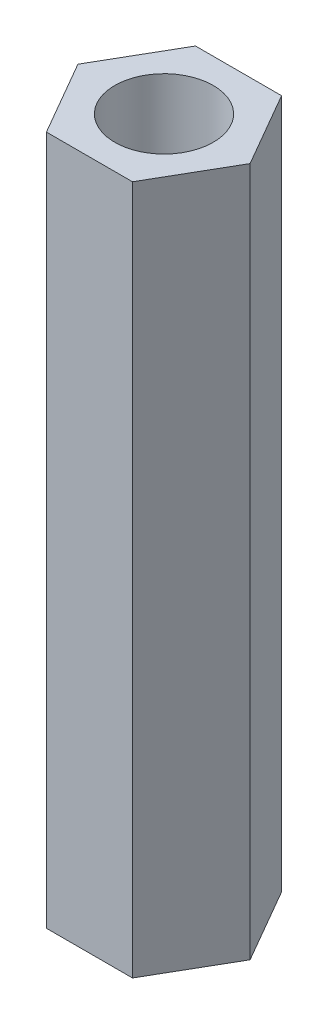
ISO-10303-21;
HEADER;
FILE_DESCRIPTION(('STEP AP214'),'2;1');
FILE_NAME('part.step','',(''),(''),'','','');
FILE_SCHEMA(('AUTOMOTIVE_DESIGN { 1 0 10303 214 1 1 1 1 }'));
ENDSEC;
DATA;
#1=APPLICATION_CONTEXT('core data for automotive mechanical design processes');
#2=APPLICATION_PROTOCOL_DEFINITION('international standard','automotive_design',2000,#1);
#3=PRODUCT_CONTEXT('',#1,'mechanical');
#4=PRODUCT('Part','Part','',(#3));
#5=PRODUCT_RELATED_PRODUCT_CATEGORY('part','',(#4));
#6=PRODUCT_DEFINITION_FORMATION('','',#4);
#7=PRODUCT_DEFINITION_CONTEXT('part definition',#1,'design');
#8=PRODUCT_DEFINITION('design','',#6,#7);
#9=PRODUCT_DEFINITION_SHAPE('','',#8);
#10=(LENGTH_UNIT() NAMED_UNIT(*) SI_UNIT(.MILLI.,.METRE.));
#11=(NAMED_UNIT(*) PLANE_ANGLE_UNIT() SI_UNIT($,.RADIAN.));
#12=(NAMED_UNIT(*) SI_UNIT($,.STERADIAN.) SOLID_ANGLE_UNIT());
#13=UNCERTAINTY_MEASURE_WITH_UNIT(LENGTH_MEASURE(1.E-05),#10,'distance_accuracy_value','');
#14=(GEOMETRIC_REPRESENTATION_CONTEXT(3) GLOBAL_UNCERTAINTY_ASSIGNED_CONTEXT((#13)) GLOBAL_UNIT_ASSIGNED_CONTEXT((#10,
#11,#12)) REPRESENTATION_CONTEXT('',''));
#15=CARTESIAN_POINT('',(0.,0.,0.));
#16=DIRECTION('',(0.,0.,1.));
#17=DIRECTION('',(1.,0.,0.));
#18=AXIS2_PLACEMENT_3D('',#15,#16,#17);
#19=CARTESIAN_POINT('',(0.,21.,0.));
#20=DIRECTION('',(0.,1.,0.));
#21=DIRECTION('',(0.,0.,1.));
#22=AXIS2_PLACEMENT_3D('',#19,#20,#21);
#23=PLANE('',#22);
#24=DIRECTION('',(0.499999999999995,0.,-0.866025403784441));
#25=VECTOR('',#24,1.);
#26=CARTESIAN_POINT('',(1.31058511106047,21.,2.26999999999998));
#27=LINE('',#26,#25);
#28=CARTESIAN_POINT('',(1.31058511106047,21.,2.26999999999998));
#29=VERTEX_POINT('',#28);
#30=CARTESIAN_POINT('',(2.62117022212089,21.,0.));
#31=VERTEX_POINT('',#30);
#32=EDGE_CURVE('E131',#29,#31,#27,.T.);
#33=ORIENTED_EDGE('',*,*,#32,.T.);
#34=DIRECTION('',(-0.500000000000001,0.,-0.866025403784438));
#35=VECTOR('',#34,1.);
#36=CARTESIAN_POINT('',(2.62117022212089,21.,0.));
#37=LINE('',#36,#35);
#38=CARTESIAN_POINT('',(1.31058511106044,21.,-2.27));
#39=VERTEX_POINT('',#38);
#40=EDGE_CURVE('E89',#31,#39,#37,.T.);
#41=ORIENTED_EDGE('',*,*,#40,.T.);
#42=DIRECTION('',(-1.,0.,0.));
#43=VECTOR('',#42,1.);
#44=CARTESIAN_POINT('',(1.31058511106044,21.,-2.27));
#45=LINE('',#44,#43);
#46=CARTESIAN_POINT('',(-1.31058511106046,21.,-2.26999999999999));
#47=VERTEX_POINT('',#46);
#48=EDGE_CURVE('E102',#39,#47,#45,.T.);
#49=ORIENTED_EDGE('',*,*,#48,.T.);
#50=DIRECTION('',(-0.499999999999995,0.,0.866025403784442));
#51=VECTOR('',#50,1.);
#52=CARTESIAN_POINT('',(-1.31058511106046,21.,-2.26999999999999));
#53=LINE('',#52,#51);
#54=CARTESIAN_POINT('',(-2.62117022212089,21.,0.));
#55=VERTEX_POINT('',#54);
#56=EDGE_CURVE('E96',#47,#55,#53,.T.);
#57=ORIENTED_EDGE('',*,*,#56,.T.);
#58=DIRECTION('',(0.500000000000007,0.,0.866025403784435));
#59=VECTOR('',#58,1.);
#60=CARTESIAN_POINT('',(-2.62117022212089,21.,0.));
#61=LINE('',#60,#59);
#62=CARTESIAN_POINT('',(-1.31058511106042,21.,2.27));
#63=VERTEX_POINT('',#62);
#64=EDGE_CURVE('E100',#55,#63,#61,.T.);
#65=ORIENTED_EDGE('',*,*,#64,.T.);
#66=DIRECTION('',(1.,0.,0.));
#67=VECTOR('',#66,1.);
#68=CARTESIAN_POINT('',(-1.31058511106042,21.,2.27));
#69=LINE('',#68,#67);
#70=EDGE_CURVE('E52',#63,#29,#69,.T.);
#71=ORIENTED_EDGE('',*,*,#70,.T.);
#72=EDGE_LOOP('',(#33,#41,#49,#57,#65,#71));
#73=FACE_BOUND('',#72,.T.);
#74=CARTESIAN_POINT('',(0.,21.,0.));
#75=DIRECTION('',(0.,1.,0.));
#76=DIRECTION('',(0.,0.,1.));
#77=AXIS2_PLACEMENT_3D('',#74,#75,#76);
#78=CIRCLE('',#77,1.5);
#79=CARTESIAN_POINT('',(0.,21.,-1.5));
#80=VERTEX_POINT('',#79);
#81=EDGE_CURVE('E124',#80,#80,#78,.T.);
#82=ORIENTED_EDGE('',*,*,#81,.F.);
#83=EDGE_LOOP('',(#82));
#84=FACE_BOUND('',#83,.T.);
#85=ADVANCED_FACE('F35',(#73,#84),#23,.T.);
#86=CARTESIAN_POINT('',(0.,0.,0.));
#87=DIRECTION('',(0.,1.,0.));
#88=DIRECTION('',(0.,0.,1.));
#89=AXIS2_PLACEMENT_3D('',#86,#87,#88);
#90=PLANE('',#89);
#91=DIRECTION('',(0.499999999999995,0.,-0.866025403784441));
#92=VECTOR('',#91,1.);
#93=CARTESIAN_POINT('',(1.31058511106047,0.,2.26999999999998));
#94=LINE('',#93,#92);
#95=CARTESIAN_POINT('',(1.31058511106047,0.,2.26999999999998));
#96=VERTEX_POINT('',#95);
#97=CARTESIAN_POINT('',(2.62117022212089,0.,0.));
#98=VERTEX_POINT('',#97);
#99=EDGE_CURVE('E120',#96,#98,#94,.T.);
#100=ORIENTED_EDGE('',*,*,#99,.F.);
#101=DIRECTION('',(1.,0.,0.));
#102=VECTOR('',#101,1.);
#103=CARTESIAN_POINT('',(-1.31058511106042,0.,2.27));
#104=LINE('',#103,#102);
#105=CARTESIAN_POINT('',(-1.31058511106042,0.,2.27));
#106=VERTEX_POINT('',#105);
#107=EDGE_CURVE('E81',#106,#96,#104,.T.);
#108=ORIENTED_EDGE('',*,*,#107,.F.);
#109=DIRECTION('',(0.500000000000007,0.,0.866025403784435));
#110=VECTOR('',#109,1.);
#111=CARTESIAN_POINT('',(-2.62117022212089,0.,0.));
#112=LINE('',#111,#110);
#113=CARTESIAN_POINT('',(-2.62117022212089,0.,0.));
#114=VERTEX_POINT('',#113);
#115=EDGE_CURVE('E75',#114,#106,#112,.T.);
#116=ORIENTED_EDGE('',*,*,#115,.F.);
#117=DIRECTION('',(-0.499999999999995,0.,0.866025403784442));
#118=VECTOR('',#117,1.);
#119=CARTESIAN_POINT('',(-1.31058511106046,0.,-2.26999999999999));
#120=LINE('',#119,#118);
#121=CARTESIAN_POINT('',(-1.31058511106046,0.,-2.26999999999999));
#122=VERTEX_POINT('',#121);
#123=EDGE_CURVE('E110',#122,#114,#120,.T.);
#124=ORIENTED_EDGE('',*,*,#123,.F.);
#125=DIRECTION('',(-1.,0.,0.));
#126=VECTOR('',#125,1.);
#127=CARTESIAN_POINT('',(1.31058511106044,0.,-2.27));
#128=LINE('',#127,#126);
#129=CARTESIAN_POINT('',(1.31058511106044,0.,-2.27));
#130=VERTEX_POINT('',#129);
#131=EDGE_CURVE('E126',#130,#122,#128,.T.);
#132=ORIENTED_EDGE('',*,*,#131,.F.);
#133=DIRECTION('',(-0.500000000000001,0.,-0.866025403784438));
#134=VECTOR('',#133,1.);
#135=CARTESIAN_POINT('',(2.62117022212089,0.,0.));
#136=LINE('',#135,#134);
#137=EDGE_CURVE('E123',#98,#130,#136,.T.);
#138=ORIENTED_EDGE('',*,*,#137,.F.);
#139=EDGE_LOOP('',(#100,#108,#116,#124,#132,#138));
#140=FACE_BOUND('',#139,.T.);
#141=CARTESIAN_POINT('',(0.,0.,0.));
#142=DIRECTION('',(0.,1.,0.));
#143=DIRECTION('',(0.,0.,1.));
#144=AXIS2_PLACEMENT_3D('',#141,#142,#143);
#145=CIRCLE('',#144,1.5);
#146=CARTESIAN_POINT('',(0.,0.,-1.5));
#147=VERTEX_POINT('',#146);
#148=EDGE_CURVE('E224',#147,#147,#145,.T.);
#149=ORIENTED_EDGE('',*,*,#148,.T.);
#150=EDGE_LOOP('',(#149));
#151=FACE_BOUND('',#150,.T.);
#152=ADVANCED_FACE('F140',(#140,#151),#90,.F.);
#153=CARTESIAN_POINT('',(1.31058511106047,21.,2.26999999999998));
#154=DIRECTION('',(-0.866025403784441,0.,-0.499999999999995));
#155=DIRECTION('',(-0.499999999999995,0.,0.866025403784442));
#156=AXIS2_PLACEMENT_3D('',#153,#154,#155);
#157=PLANE('',#156);
#158=ORIENTED_EDGE('',*,*,#99,.T.);
#159=DIRECTION('',(0.,-1.,0.));
#160=VECTOR('',#159,1.);
#161=CARTESIAN_POINT('',(2.62117022212089,21.,0.));
#162=LINE('',#161,#160);
#163=EDGE_CURVE('E11',#31,#98,#162,.T.);
#164=ORIENTED_EDGE('',*,*,#163,.F.);
#165=ORIENTED_EDGE('',*,*,#32,.F.);
#166=DIRECTION('',(0.,-1.,0.));
#167=VECTOR('',#166,1.);
#168=CARTESIAN_POINT('',(1.31058511106047,21.,2.26999999999998));
#169=LINE('',#168,#167);
#170=EDGE_CURVE('E116',#29,#96,#169,.T.);
#171=ORIENTED_EDGE('',*,*,#170,.T.);
#172=EDGE_LOOP('',(#158,#164,#165,#171));
#173=FACE_BOUND('',#172,.T.);
#174=ADVANCED_FACE('F37',(#173),#157,.F.);
#175=CARTESIAN_POINT('',(2.62117022212089,21.,0.));
#176=DIRECTION('',(-0.866025403784438,0.,0.500000000000001));
#177=DIRECTION('',(0.500000000000001,0.,0.866025403784438));
#178=AXIS2_PLACEMENT_3D('',#175,#176,#177);
#179=PLANE('',#178);
#180=ORIENTED_EDGE('',*,*,#137,.T.);
#181=DIRECTION('',(0.,-1.,0.));
#182=VECTOR('',#181,1.);
#183=CARTESIAN_POINT('',(1.31058511106044,21.,-2.27));
#184=LINE('',#183,#182);
#185=EDGE_CURVE('E44',#39,#130,#184,.T.);
#186=ORIENTED_EDGE('',*,*,#185,.F.);
#187=ORIENTED_EDGE('',*,*,#40,.F.);
#188=ORIENTED_EDGE('',*,*,#163,.T.);
#189=EDGE_LOOP('',(#180,#186,#187,#188));
#190=FACE_BOUND('',#189,.T.);
#191=ADVANCED_FACE('F165',(#190),#179,.F.);
#192=CARTESIAN_POINT('',(1.31058511106044,21.,-2.27));
#193=DIRECTION('',(0.,0.,1.));
#194=DIRECTION('',(1.,0.,0.));
#195=AXIS2_PLACEMENT_3D('',#192,#193,#194);
#196=PLANE('',#195);
#197=ORIENTED_EDGE('',*,*,#131,.T.);
#198=DIRECTION('',(0.,-1.,0.));
#199=VECTOR('',#198,1.);
#200=CARTESIAN_POINT('',(-1.31058511106046,21.,-2.26999999999999));
#201=LINE('',#200,#199);
#202=EDGE_CURVE('E111',#47,#122,#201,.T.);
#203=ORIENTED_EDGE('',*,*,#202,.F.);
#204=ORIENTED_EDGE('',*,*,#48,.F.);
#205=ORIENTED_EDGE('',*,*,#185,.T.);
#206=EDGE_LOOP('',(#197,#203,#204,#205));
#207=FACE_BOUND('',#206,.T.);
#208=ADVANCED_FACE('F137',(#207),#196,.F.);
#209=CARTESIAN_POINT('',(-1.31058511106046,21.,-2.26999999999999));
#210=DIRECTION('',(0.866025403784442,0.,0.499999999999995));
#211=DIRECTION('',(0.499999999999995,0.,-0.866025403784442));
#212=AXIS2_PLACEMENT_3D('',#209,#210,#211);
#213=PLANE('',#212);
#214=ORIENTED_EDGE('',*,*,#123,.T.);
#215=DIRECTION('',(0.,-1.,0.));
#216=VECTOR('',#215,1.);
#217=CARTESIAN_POINT('',(-2.62117022212089,21.,0.));
#218=LINE('',#217,#216);
#219=EDGE_CURVE('E107',#55,#114,#218,.T.);
#220=ORIENTED_EDGE('',*,*,#219,.F.);
#221=ORIENTED_EDGE('',*,*,#56,.F.);
#222=ORIENTED_EDGE('',*,*,#202,.T.);
#223=EDGE_LOOP('',(#214,#220,#221,#222));
#224=FACE_BOUND('',#223,.T.);
#225=ADVANCED_FACE('F108',(#224),#213,.F.);
#226=CARTESIAN_POINT('',(-2.62117022212089,21.,0.));
#227=DIRECTION('',(0.866025403784434,0.,-0.500000000000007));
#228=DIRECTION('',(-0.500000000000007,0.,-0.866025403784435));
#229=AXIS2_PLACEMENT_3D('',#226,#227,#228);
#230=PLANE('',#229);
#231=ORIENTED_EDGE('',*,*,#115,.T.);
#232=DIRECTION('',(0.,-1.,0.));
#233=VECTOR('',#232,1.);
#234=CARTESIAN_POINT('',(-1.31058511106042,21.,2.27));
#235=LINE('',#234,#233);
#236=EDGE_CURVE('E112',#63,#106,#235,.T.);
#237=ORIENTED_EDGE('',*,*,#236,.F.);
#238=ORIENTED_EDGE('',*,*,#64,.F.);
#239=ORIENTED_EDGE('',*,*,#219,.T.);
#240=EDGE_LOOP('',(#231,#237,#238,#239));
#241=FACE_BOUND('',#240,.T.);
#242=ADVANCED_FACE('F114',(#241),#230,.F.);
#243=CARTESIAN_POINT('',(-1.31058511106042,21.,2.27));
#244=DIRECTION('',(0.,0.,-1.));
#245=DIRECTION('',(-1.,0.,0.));
#246=AXIS2_PLACEMENT_3D('',#243,#244,#245);
#247=PLANE('',#246);
#248=ORIENTED_EDGE('',*,*,#107,.T.);
#249=ORIENTED_EDGE('',*,*,#170,.F.);
#250=ORIENTED_EDGE('',*,*,#70,.F.);
#251=ORIENTED_EDGE('',*,*,#236,.T.);
#252=EDGE_LOOP('',(#248,#249,#250,#251));
#253=FACE_BOUND('',#252,.T.);
#254=ADVANCED_FACE('F145',(#253),#247,.F.);
#255=CARTESIAN_POINT('',(0.,21.,0.));
#256=DIRECTION('',(0.,-1.,0.));
#257=DIRECTION('',(0.,0.,-1.));
#258=AXIS2_PLACEMENT_3D('',#255,#256,#257);
#259=CYLINDRICAL_SURFACE('',#258,1.5);
#260=CARTESIAN_POINT('',(0.,21.,-1.5));
#261=CARTESIAN_POINT('',(0.,20.78125,-1.5));
#262=CARTESIAN_POINT('',(0.,20.5625,-1.5));
#263=CARTESIAN_POINT('',(0.,20.125,-1.5));
#264=CARTESIAN_POINT('',(0.,19.90625,-1.5));
#265=CARTESIAN_POINT('',(0.,19.46875,-1.5));
#266=CARTESIAN_POINT('',(0.,19.25,-1.5));
#267=CARTESIAN_POINT('',(0.,18.8125,-1.5));
#268=CARTESIAN_POINT('',(0.,18.59375,-1.5));
#269=CARTESIAN_POINT('',(0.,18.15625,-1.5));
#270=CARTESIAN_POINT('',(0.,17.9375,-1.5));
#271=CARTESIAN_POINT('',(0.,17.5,-1.5));
#272=CARTESIAN_POINT('',(0.,17.28125,-1.5));
#273=CARTESIAN_POINT('',(0.,16.84375,-1.5));
#274=CARTESIAN_POINT('',(0.,16.625,-1.5));
#275=CARTESIAN_POINT('',(0.,16.1875,-1.5));
#276=CARTESIAN_POINT('',(0.,15.96875,-1.5));
#277=CARTESIAN_POINT('',(0.,15.53125,-1.5));
#278=CARTESIAN_POINT('',(0.,15.3125,-1.5));
#279=CARTESIAN_POINT('',(0.,14.875,-1.5));
#280=CARTESIAN_POINT('',(0.,14.65625,-1.5));
#281=CARTESIAN_POINT('',(0.,14.21875,-1.5));
#282=CARTESIAN_POINT('',(0.,14.,-1.5));
#283=CARTESIAN_POINT('',(0.,13.5625,-1.5));
#284=CARTESIAN_POINT('',(0.,13.34375,-1.5));
#285=CARTESIAN_POINT('',(0.,12.90625,-1.5));
#286=CARTESIAN_POINT('',(0.,12.6875,-1.5));
#287=CARTESIAN_POINT('',(0.,12.25,-1.5));
#288=CARTESIAN_POINT('',(0.,12.03125,-1.5));
#289=CARTESIAN_POINT('',(0.,11.59375,-1.5));
#290=CARTESIAN_POINT('',(0.,11.375,-1.5));
#291=CARTESIAN_POINT('',(0.,10.9375,-1.5));
#292=CARTESIAN_POINT('',(0.,10.71875,-1.5));
#293=CARTESIAN_POINT('',(0.,10.28125,-1.5));
#294=CARTESIAN_POINT('',(0.,10.0625,-1.5));
#295=CARTESIAN_POINT('',(0.,9.625,-1.5));
#296=CARTESIAN_POINT('',(0.,9.40625,-1.5));
#297=CARTESIAN_POINT('',(0.,8.96875,-1.5));
#298=CARTESIAN_POINT('',(0.,8.75,-1.5));
#299=CARTESIAN_POINT('',(0.,8.3125,-1.5));
#300=CARTESIAN_POINT('',(0.,8.09375,-1.5));
#301=CARTESIAN_POINT('',(0.,7.65625,-1.5));
#302=CARTESIAN_POINT('',(0.,7.4375,-1.5));
#303=CARTESIAN_POINT('',(0.,7.,-1.5));
#304=CARTESIAN_POINT('',(0.,6.78125,-1.5));
#305=CARTESIAN_POINT('',(0.,6.34375,-1.5));
#306=CARTESIAN_POINT('',(0.,6.125,-1.5));
#307=CARTESIAN_POINT('',(0.,5.6875,-1.5));
#308=CARTESIAN_POINT('',(0.,5.46875,-1.5));
#309=CARTESIAN_POINT('',(0.,5.03125,-1.5));
#310=CARTESIAN_POINT('',(0.,4.8125,-1.5));
#311=CARTESIAN_POINT('',(0.,4.375,-1.5));
#312=CARTESIAN_POINT('',(0.,4.15625,-1.5));
#313=CARTESIAN_POINT('',(0.,3.71875,-1.5));
#314=CARTESIAN_POINT('',(0.,3.5,-1.5));
#315=CARTESIAN_POINT('',(0.,3.0625,-1.5));
#316=CARTESIAN_POINT('',(0.,2.84375,-1.5));
#317=CARTESIAN_POINT('',(0.,2.40625,-1.5));
#318=CARTESIAN_POINT('',(0.,2.1875,-1.5));
#319=CARTESIAN_POINT('',(0.,1.75,-1.5));
#320=CARTESIAN_POINT('',(0.,1.53125,-1.5));
#321=CARTESIAN_POINT('',(0.,1.09375,-1.5));
#322=CARTESIAN_POINT('',(0.,0.875000000000001,-1.5));
#323=CARTESIAN_POINT('',(0.,0.4375,-1.5));
#324=CARTESIAN_POINT('',(0.,0.21875,-1.5));
#325=CARTESIAN_POINT('',(0.,0.,-1.5));
#326=B_SPLINE_CURVE_WITH_KNOTS('',3,(#260,#261,#262,#263,#264,#265,#266,#267,#268,#269,#270,
#271,#272,#273,#274,#275,#276,#277,#278,#279,#280,#281,#282,#283,#284,#285,#286,#287,#288,#289,
#290,#291,#292,#293,#294,#295,#296,#297,#298,#299,#300,#301,#302,#303,#304,#305,#306,#307,#308,
#309,#310,#311,#312,#313,#314,#315,#316,#317,#318,#319,#320,#321,#322,#323,#324,#325),
.UNSPECIFIED.,.F.,.F.,(4,2,2,2,2,2,2,2,2,2,2,2,2,2,2,2,2,2,2,2,2,2,2,2,2,2,2,2,2,2,2,2,4),(0.,
0.656249999999997,1.3125,1.96875,2.625,3.28125,3.9375,4.59375,5.25,5.90625,6.5625,7.21875,7.875,
8.53125,9.1875,9.84375,10.5,11.15625,11.8125,12.46875,13.125,13.78125,14.4375,15.09375,15.75,
16.40625,17.0625,17.71875,18.375,19.03125,19.6875,20.34375,21.),.UNSPECIFIED.);
#327=EDGE_CURVE('BSEAM147',#80,#147,#326,.T.);
#328=ORIENTED_EDGE('',*,*,#81,.T.);
#329=ORIENTED_EDGE('',*,*,#148,.F.);
#330=ORIENTED_EDGE('',*,*,#327,.T.);
#331=ORIENTED_EDGE('',*,*,#327,.F.);
#332=EDGE_LOOP('',(#328,#330,#329,#331));
#333=FACE_BOUND('',#332,.T.);
#334=ADVANCED_FACE('F147',(#333),#259,.F.);
#335=CLOSED_SHELL('',(#85,#152,#174,#191,#208,#225,#242,#254,#334));
#336=MANIFOLD_SOLID_BREP('B2',#335);
#337=ADVANCED_BREP_SHAPE_REPRESENTATION('',(#18,#336),#14);
#338=SHAPE_DEFINITION_REPRESENTATION(#9,#337);
ENDSEC;
END-ISO-10303-21;
